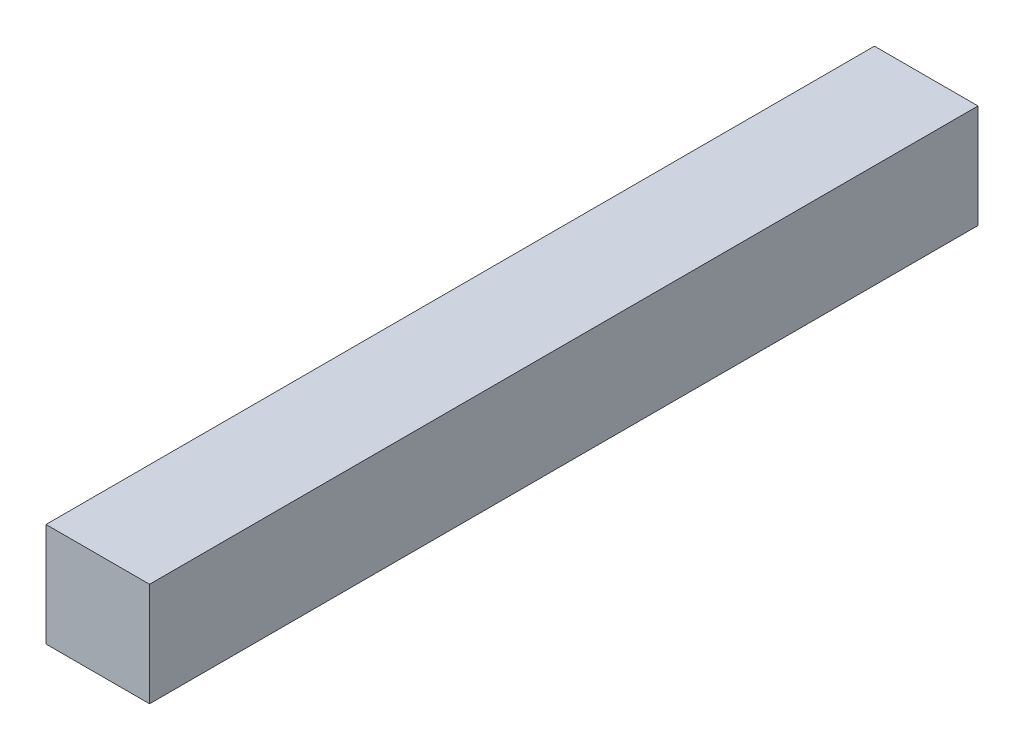
ISO-10303-21;
HEADER;
FILE_DESCRIPTION(('STEP AP214'),'2;1');
FILE_NAME('part.step','',(''),(''),'','','');
FILE_SCHEMA(('AUTOMOTIVE_DESIGN { 1 0 10303 214 1 1 1 1 }'));
ENDSEC;
DATA;
#1=APPLICATION_CONTEXT('core data for automotive mechanical design processes');
#2=APPLICATION_PROTOCOL_DEFINITION('international standard','automotive_design',2000,#1);
#3=PRODUCT_CONTEXT('',#1,'mechanical');
#4=PRODUCT('Part','Part','',(#3));
#5=PRODUCT_RELATED_PRODUCT_CATEGORY('part','',(#4));
#6=PRODUCT_DEFINITION_FORMATION('','',#4);
#7=PRODUCT_DEFINITION_CONTEXT('part definition',#1,'design');
#8=PRODUCT_DEFINITION('design','',#6,#7);
#9=PRODUCT_DEFINITION_SHAPE('','',#8);
#10=(LENGTH_UNIT() NAMED_UNIT(*) SI_UNIT(.MILLI.,.METRE.));
#11=(NAMED_UNIT(*) PLANE_ANGLE_UNIT() SI_UNIT($,.RADIAN.));
#12=(NAMED_UNIT(*) SI_UNIT($,.STERADIAN.) SOLID_ANGLE_UNIT());
#13=UNCERTAINTY_MEASURE_WITH_UNIT(LENGTH_MEASURE(1.E-05),#10,'distance_accuracy_value','');
#14=(GEOMETRIC_REPRESENTATION_CONTEXT(3) GLOBAL_UNCERTAINTY_ASSIGNED_CONTEXT((#13)) GLOBAL_UNIT_ASSIGNED_CONTEXT((#10,
#11,#12)) REPRESENTATION_CONTEXT('',''));
#15=CARTESIAN_POINT('',(0.,0.,0.));
#16=DIRECTION('',(0.,0.,1.));
#17=DIRECTION('',(1.,0.,0.));
#18=AXIS2_PLACEMENT_3D('',#15,#16,#17);
#19=CARTESIAN_POINT('',(10000.,0.,40000.));
#20=DIRECTION('',(0.,0.,-1.));
#21=DIRECTION('',(-1.,0.,0.));
#22=AXIS2_PLACEMENT_3D('',#19,#20,#21);
#23=PLANE('',#22);
#24=DIRECTION('',(0.,-1.,0.));
#25=VECTOR('',#24,1.);
#26=CARTESIAN_POINT('',(0.,0.,40000.));
#27=LINE('',#26,#25);
#28=CARTESIAN_POINT('',(0.,10000.,40000.));
#29=VERTEX_POINT('',#28);
#30=CARTESIAN_POINT('',(0.,0.,40000.));
#31=VERTEX_POINT('',#30);
#32=EDGE_CURVE('E98',#29,#31,#27,.T.);
#33=ORIENTED_EDGE('',*,*,#32,.T.);
#34=DIRECTION('',(-1.,0.,0.));
#35=VECTOR('',#34,1.);
#36=CARTESIAN_POINT('',(10000.,0.,40000.));
#37=LINE('',#36,#35);
#38=CARTESIAN_POINT('',(10000.,0.,40000.));
#39=VERTEX_POINT('',#38);
#40=EDGE_CURVE('E11',#39,#31,#37,.T.);
#41=ORIENTED_EDGE('',*,*,#40,.F.);
#42=DIRECTION('',(0.,-1.,0.));
#43=VECTOR('',#42,1.);
#44=CARTESIAN_POINT('',(10000.,0.,40000.));
#45=LINE('',#44,#43);
#46=CARTESIAN_POINT('',(10000.,10000.,40000.));
#47=VERTEX_POINT('',#46);
#48=EDGE_CURVE('E86',#47,#39,#45,.T.);
#49=ORIENTED_EDGE('',*,*,#48,.F.);
#50=DIRECTION('',(-1.,0.,0.));
#51=VECTOR('',#50,1.);
#52=CARTESIAN_POINT('',(10000.,10000.,40000.));
#53=LINE('',#52,#51);
#54=EDGE_CURVE('E94',#47,#29,#53,.T.);
#55=ORIENTED_EDGE('',*,*,#54,.T.);
#56=EDGE_LOOP('',(#33,#41,#49,#55));
#57=FACE_BOUND('',#56,.T.);
#58=ADVANCED_FACE('F35',(#57),#23,.F.);
#59=CARTESIAN_POINT('',(10000.,0.,40000.));
#60=DIRECTION('',(0.,1.,0.));
#61=DIRECTION('',(0.,0.,1.));
#62=AXIS2_PLACEMENT_3D('',#59,#60,#61);
#63=PLANE('',#62);
#64=DIRECTION('',(0.,0.,-1.));
#65=VECTOR('',#64,1.);
#66=CARTESIAN_POINT('',(0.,0.,40000.));
#67=LINE('',#66,#65);
#68=CARTESIAN_POINT('',(0.,0.,-40000.));
#69=VERTEX_POINT('',#68);
#70=EDGE_CURVE('E90',#31,#69,#67,.T.);
#71=ORIENTED_EDGE('',*,*,#70,.T.);
#72=DIRECTION('',(-1.,0.,0.));
#73=VECTOR('',#72,1.);
#74=CARTESIAN_POINT('',(10000.,0.,-40000.));
#75=LINE('',#74,#73);
#76=CARTESIAN_POINT('',(10000.,0.,-40000.));
#77=VERTEX_POINT('',#76);
#78=EDGE_CURVE('E43',#77,#69,#75,.T.);
#79=ORIENTED_EDGE('',*,*,#78,.F.);
#80=DIRECTION('',(0.,0.,-1.));
#81=VECTOR('',#80,1.);
#82=CARTESIAN_POINT('',(10000.,0.,40000.));
#83=LINE('',#82,#81);
#84=EDGE_CURVE('E81',#39,#77,#83,.T.);
#85=ORIENTED_EDGE('',*,*,#84,.F.);
#86=ORIENTED_EDGE('',*,*,#40,.T.);
#87=EDGE_LOOP('',(#71,#79,#85,#86));
#88=FACE_BOUND('',#87,.T.);
#89=ADVANCED_FACE('F89',(#88),#63,.F.);
#90=CARTESIAN_POINT('',(10000.,0.,-40000.));
#91=DIRECTION('',(0.,0.,1.));
#92=DIRECTION('',(1.,0.,0.));
#93=AXIS2_PLACEMENT_3D('',#90,#91,#92);
#94=PLANE('',#93);
#95=DIRECTION('',(0.,1.,0.));
#96=VECTOR('',#95,1.);
#97=CARTESIAN_POINT('',(0.,0.,-40000.));
#98=LINE('',#97,#96);
#99=CARTESIAN_POINT('',(0.,10000.,-40000.));
#100=VERTEX_POINT('',#99);
#101=EDGE_CURVE('E68',#69,#100,#98,.T.);
#102=ORIENTED_EDGE('',*,*,#101,.T.);
#103=DIRECTION('',(-1.,0.,0.));
#104=VECTOR('',#103,1.);
#105=CARTESIAN_POINT('',(10000.,10000.,-40000.));
#106=LINE('',#105,#104);
#107=CARTESIAN_POINT('',(10000.,10000.,-40000.));
#108=VERTEX_POINT('',#107);
#109=EDGE_CURVE('E91',#108,#100,#106,.T.);
#110=ORIENTED_EDGE('',*,*,#109,.F.);
#111=DIRECTION('',(0.,1.,0.));
#112=VECTOR('',#111,1.);
#113=CARTESIAN_POINT('',(10000.,0.,-40000.));
#114=LINE('',#113,#112);
#115=EDGE_CURVE('E84',#77,#108,#114,.T.);
#116=ORIENTED_EDGE('',*,*,#115,.F.);
#117=ORIENTED_EDGE('',*,*,#78,.T.);
#118=EDGE_LOOP('',(#102,#110,#116,#117));
#119=FACE_BOUND('',#118,.T.);
#120=ADVANCED_FACE('F92',(#119),#94,.F.);
#121=CARTESIAN_POINT('',(10000.,10000.,40000.));
#122=DIRECTION('',(0.,-1.,0.));
#123=DIRECTION('',(0.,0.,-1.));
#124=AXIS2_PLACEMENT_3D('',#121,#122,#123);
#125=PLANE('',#124);
#126=DIRECTION('',(0.,0.,1.));
#127=VECTOR('',#126,1.);
#128=CARTESIAN_POINT('',(0.,10000.,40000.));
#129=LINE('',#128,#127);
#130=EDGE_CURVE('E74',#100,#29,#129,.T.);
#131=ORIENTED_EDGE('',*,*,#130,.T.);
#132=ORIENTED_EDGE('',*,*,#54,.F.);
#133=DIRECTION('',(0.,0.,1.));
#134=VECTOR('',#133,1.);
#135=CARTESIAN_POINT('',(10000.,10000.,40000.));
#136=LINE('',#135,#134);
#137=EDGE_CURVE('E51',#108,#47,#136,.T.);
#138=ORIENTED_EDGE('',*,*,#137,.F.);
#139=ORIENTED_EDGE('',*,*,#109,.T.);
#140=EDGE_LOOP('',(#131,#132,#138,#139));
#141=FACE_BOUND('',#140,.T.);
#142=ADVANCED_FACE('F105',(#141),#125,.F.);
#143=CARTESIAN_POINT('',(10000.,0.,0.));
#144=DIRECTION('',(-1.,0.,0.));
#145=DIRECTION('',(0.,0.,1.));
#146=AXIS2_PLACEMENT_3D('',#143,#144,#145);
#147=PLANE('',#146);
#148=ORIENTED_EDGE('',*,*,#48,.T.);
#149=ORIENTED_EDGE('',*,*,#84,.T.);
#150=ORIENTED_EDGE('',*,*,#115,.T.);
#151=ORIENTED_EDGE('',*,*,#137,.T.);
#152=EDGE_LOOP('',(#148,#149,#150,#151));
#153=FACE_BOUND('',#152,.T.);
#154=ADVANCED_FACE('F82',(#153),#147,.F.);
#155=CARTESIAN_POINT('',(0.,0.,0.));
#156=DIRECTION('',(-1.,0.,0.));
#157=DIRECTION('',(0.,0.,1.));
#158=AXIS2_PLACEMENT_3D('',#155,#156,#157);
#159=PLANE('',#158);
#160=ORIENTED_EDGE('',*,*,#32,.F.);
#161=ORIENTED_EDGE('',*,*,#130,.F.);
#162=ORIENTED_EDGE('',*,*,#101,.F.);
#163=ORIENTED_EDGE('',*,*,#70,.F.);
#164=EDGE_LOOP('',(#160,#161,#162,#163));
#165=FACE_BOUND('',#164,.T.);
#166=ADVANCED_FACE('F108',(#165),#159,.T.);
#167=CLOSED_SHELL('',(#58,#89,#120,#142,#154,#166));
#168=MANIFOLD_SOLID_BREP('B2',#167);
#169=ADVANCED_BREP_SHAPE_REPRESENTATION('',(#18,#168),#14);
#170=SHAPE_DEFINITION_REPRESENTATION(#9,#169);
ENDSEC;
END-ISO-10303-21;
